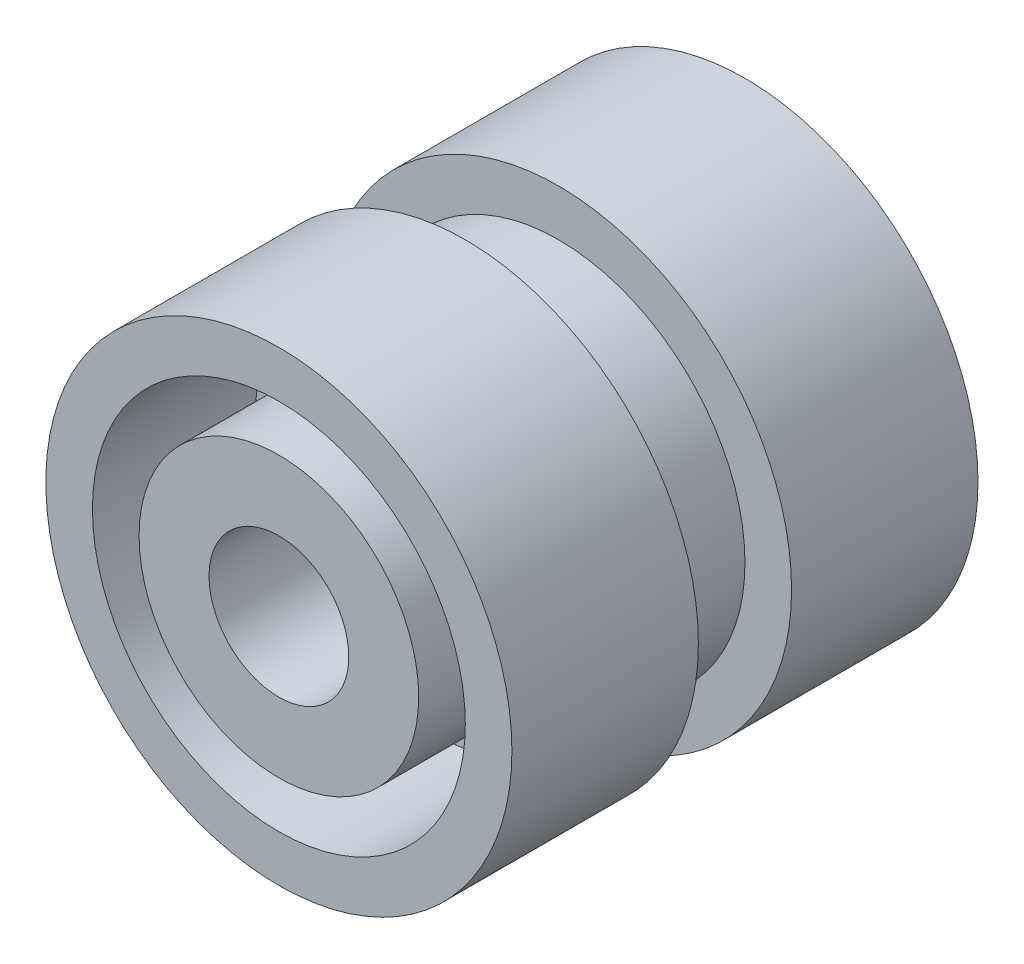
ISO-10303-21;
HEADER;
FILE_DESCRIPTION(('STEP AP214'),'2;1');
FILE_NAME('part.step','',(''),(''),'','','');
FILE_SCHEMA(('AUTOMOTIVE_DESIGN { 1 0 10303 214 1 1 1 1 }'));
ENDSEC;
DATA;
#1=APPLICATION_CONTEXT('core data for automotive mechanical design processes');
#2=APPLICATION_PROTOCOL_DEFINITION('international standard','automotive_design',2000,#1);
#3=PRODUCT_CONTEXT('',#1,'mechanical');
#4=PRODUCT('Part','Part','',(#3));
#5=PRODUCT_RELATED_PRODUCT_CATEGORY('part','',(#4));
#6=PRODUCT_DEFINITION_FORMATION('','',#4);
#7=PRODUCT_DEFINITION_CONTEXT('part definition',#1,'design');
#8=PRODUCT_DEFINITION('design','',#6,#7);
#9=PRODUCT_DEFINITION_SHAPE('','',#8);
#10=(LENGTH_UNIT() NAMED_UNIT(*) SI_UNIT(.MILLI.,.METRE.));
#11=(NAMED_UNIT(*) PLANE_ANGLE_UNIT() SI_UNIT($,.RADIAN.));
#12=(NAMED_UNIT(*) SI_UNIT($,.STERADIAN.) SOLID_ANGLE_UNIT());
#13=UNCERTAINTY_MEASURE_WITH_UNIT(LENGTH_MEASURE(1.E-05),#10,'distance_accuracy_value','');
#14=(GEOMETRIC_REPRESENTATION_CONTEXT(3) GLOBAL_UNCERTAINTY_ASSIGNED_CONTEXT((#13)) GLOBAL_UNIT_ASSIGNED_CONTEXT((#10,
#11,#12)) REPRESENTATION_CONTEXT('',''));
#15=CARTESIAN_POINT('',(0.,0.,0.));
#16=DIRECTION('',(0.,0.,1.));
#17=DIRECTION('',(1.,0.,0.));
#18=AXIS2_PLACEMENT_3D('',#15,#16,#17);
#19=CARTESIAN_POINT('',(0.,4.,-1.5));
#20=DIRECTION('',(0.,0.,1.));
#21=DIRECTION('',(1.,0.,0.));
#22=AXIS2_PLACEMENT_3D('',#19,#20,#21);
#23=PLANE('',#22);
#24=DIRECTION('',(-1.,0.,0.));
#25=VECTOR('',#24,1.);
#26=CARTESIAN_POINT('',(1.93649167310371,-0.5,-1.5));
#27=LINE('',#26,#25);
#28=CARTESIAN_POINT('',(3.96862696659689,-0.500000000000001,-1.5));
#29=VERTEX_POINT('',#28);
#30=CARTESIAN_POINT('',(1.93649167310371,-0.5,-1.5));
#31=VERTEX_POINT('',#30);
#32=EDGE_CURVE('E210',#29,#31,#27,.T.);
#33=ORIENTED_EDGE('',*,*,#32,.F.);
#34=CARTESIAN_POINT('',(0.,0.,-1.5));
#35=DIRECTION('',(0.,0.,1.));
#36=DIRECTION('',(1.,0.,0.));
#37=AXIS2_PLACEMENT_3D('',#34,#35,#36);
#38=CIRCLE('',#37,4.);
#39=CARTESIAN_POINT('',(0.500000000000001,-3.96862696659689,-1.5));
#40=VERTEX_POINT('',#39);
#41=EDGE_CURVE('E286',#40,#29,#38,.T.);
#42=ORIENTED_EDGE('',*,*,#41,.F.);
#43=DIRECTION('',(0.,-1.,0.));
#44=VECTOR('',#43,1.);
#45=CARTESIAN_POINT('',(0.5,-1.93649167310371,-1.5));
#46=LINE('',#45,#44);
#47=CARTESIAN_POINT('',(0.5,-1.93649167310371,-1.5));
#48=VERTEX_POINT('',#47);
#49=EDGE_CURVE('E216',#48,#40,#46,.T.);
#50=ORIENTED_EDGE('',*,*,#49,.F.);
#51=CARTESIAN_POINT('',(0.,0.,-1.5));
#52=DIRECTION('',(0.,0.,-1.));
#53=DIRECTION('',(-1.,0.,0.));
#54=AXIS2_PLACEMENT_3D('',#51,#52,#53);
#55=CIRCLE('',#54,2.);
#56=EDGE_CURVE('E213',#31,#48,#55,.T.);
#57=ORIENTED_EDGE('',*,*,#56,.F.);
#58=EDGE_LOOP('',(#33,#42,#50,#57));
#59=FACE_BOUND('',#58,.T.);
#60=ADVANCED_FACE('F47',(#59),#23,.F.);
#61=DIRECTION('',(0.,1.,0.));
#62=VECTOR('',#61,1.);
#63=CARTESIAN_POINT('',(-0.5,-1.93649167310371,-1.5));
#64=LINE('',#63,#62);
#65=CARTESIAN_POINT('',(-0.5,-3.96862696659689,-1.5));
#66=VERTEX_POINT('',#65);
#67=CARTESIAN_POINT('',(-0.5,-1.93649167310371,-1.5));
#68=VERTEX_POINT('',#67);
#69=EDGE_CURVE('E219',#66,#68,#64,.T.);
#70=ORIENTED_EDGE('',*,*,#69,.F.);
#71=CARTESIAN_POINT('',(-3.96862696659689,-0.500000000000001,-1.5));
#72=VERTEX_POINT('',#71);
#73=EDGE_CURVE('E420',#72,#66,#38,.T.);
#74=ORIENTED_EDGE('',*,*,#73,.F.);
#75=DIRECTION('',(-1.,0.,0.));
#76=VECTOR('',#75,1.);
#77=CARTESIAN_POINT('',(-1.93649167310371,-0.5,-1.5));
#78=LINE('',#77,#76);
#79=CARTESIAN_POINT('',(-1.93649167310371,-0.5,-1.5));
#80=VERTEX_POINT('',#79);
#81=EDGE_CURVE('E225',#80,#72,#78,.T.);
#82=ORIENTED_EDGE('',*,*,#81,.F.);
#83=CARTESIAN_POINT('',(0.,0.,-1.5));
#84=DIRECTION('',(0.,0.,-1.));
#85=DIRECTION('',(-1.,0.,0.));
#86=AXIS2_PLACEMENT_3D('',#83,#84,#85);
#87=CIRCLE('',#86,2.);
#88=EDGE_CURVE('E222',#68,#80,#87,.T.);
#89=ORIENTED_EDGE('',*,*,#88,.F.);
#90=EDGE_LOOP('',(#70,#74,#82,#89));
#91=FACE_BOUND('',#90,.T.);
#92=ADVANCED_FACE('F402',(#91),#23,.F.);
#93=DIRECTION('',(1.,0.,0.));
#94=VECTOR('',#93,1.);
#95=CARTESIAN_POINT('',(-1.93649167310371,0.5,-1.5));
#96=LINE('',#95,#94);
#97=CARTESIAN_POINT('',(-3.96862696659689,0.5,-1.5));
#98=VERTEX_POINT('',#97);
#99=CARTESIAN_POINT('',(-1.93649167310371,0.5,-1.5));
#100=VERTEX_POINT('',#99);
#101=EDGE_CURVE('E228',#98,#100,#96,.T.);
#102=ORIENTED_EDGE('',*,*,#101,.F.);
#103=CARTESIAN_POINT('',(-0.5,3.96862696659689,-1.5));
#104=VERTEX_POINT('',#103);
#105=EDGE_CURVE('E291',#104,#98,#38,.T.);
#106=ORIENTED_EDGE('',*,*,#105,.F.);
#107=DIRECTION('',(0.,1.,0.));
#108=VECTOR('',#107,1.);
#109=CARTESIAN_POINT('',(-0.5,1.93649167310371,-1.5));
#110=LINE('',#109,#108);
#111=CARTESIAN_POINT('',(-0.5,1.93649167310371,-1.5));
#112=VERTEX_POINT('',#111);
#113=EDGE_CURVE('E184',#112,#104,#110,.T.);
#114=ORIENTED_EDGE('',*,*,#113,.F.);
#115=CARTESIAN_POINT('',(0.,0.,-1.5));
#116=DIRECTION('',(0.,0.,-1.));
#117=DIRECTION('',(-1.,0.,0.));
#118=AXIS2_PLACEMENT_3D('',#115,#116,#117);
#119=CIRCLE('',#118,2.);
#120=EDGE_CURVE('E231',#100,#112,#119,.T.);
#121=ORIENTED_EDGE('',*,*,#120,.F.);
#122=EDGE_LOOP('',(#102,#106,#114,#121));
#123=FACE_BOUND('',#122,.T.);
#124=ADVANCED_FACE('F398',(#123),#23,.F.);
#125=DIRECTION('',(1.,0.,0.));
#126=VECTOR('',#125,1.);
#127=CARTESIAN_POINT('',(1.93649167310371,0.5,-1.5));
#128=LINE('',#127,#126);
#129=CARTESIAN_POINT('',(1.93649167310371,0.5,-1.5));
#130=VERTEX_POINT('',#129);
#131=CARTESIAN_POINT('',(3.96862696659689,0.499999999999999,-1.5));
#132=VERTEX_POINT('',#131);
#133=EDGE_CURVE('E207',#130,#132,#128,.T.);
#134=ORIENTED_EDGE('',*,*,#133,.F.);
#135=CARTESIAN_POINT('',(0.,0.,-1.5));
#136=DIRECTION('',(0.,0.,-1.));
#137=DIRECTION('',(-1.,0.,0.));
#138=AXIS2_PLACEMENT_3D('',#135,#136,#137);
#139=CIRCLE('',#138,2.);
#140=CARTESIAN_POINT('',(0.5,1.93649167310371,-1.5));
#141=VERTEX_POINT('',#140);
#142=EDGE_CURVE('E203',#141,#130,#139,.T.);
#143=ORIENTED_EDGE('',*,*,#142,.F.);
#144=DIRECTION('',(0.,-1.,0.));
#145=VECTOR('',#144,1.);
#146=CARTESIAN_POINT('',(0.5,1.93649167310371,-1.5));
#147=LINE('',#146,#145);
#148=CARTESIAN_POINT('',(0.5,3.96862696659689,-1.5));
#149=VERTEX_POINT('',#148);
#150=EDGE_CURVE('E126',#149,#141,#147,.T.);
#151=ORIENTED_EDGE('',*,*,#150,.F.);
#152=EDGE_CURVE('E287',#132,#149,#38,.T.);
#153=ORIENTED_EDGE('',*,*,#152,.F.);
#154=EDGE_LOOP('',(#134,#143,#151,#153));
#155=FACE_BOUND('',#154,.T.);
#156=ADVANCED_FACE('F390',(#155),#23,.F.);
#157=CARTESIAN_POINT('',(0.,0.,8.24782020276154));
#158=DIRECTION('',(0.,0.,1.));
#159=DIRECTION('',(1.,0.,0.));
#160=AXIS2_PLACEMENT_3D('',#157,#158,#159);
#161=CYLINDRICAL_SURFACE('',#160,4.);
#162=CARTESIAN_POINT('',(0.,0.,-5.));
#163=DIRECTION('',(0.,0.,1.));
#164=DIRECTION('',(1.,0.,0.));
#165=AXIS2_PLACEMENT_3D('',#162,#163,#164);
#166=CIRCLE('',#165,4.);
#167=CARTESIAN_POINT('',(4.,0.,-5.));
#168=VERTEX_POINT('',#167);
#169=EDGE_CURVE('E290',#168,#168,#166,.T.);
#170=ORIENTED_EDGE('',*,*,#169,.F.);
#171=EDGE_LOOP('',(#170));
#172=FACE_BOUND('',#171,.T.);
#173=DIRECTION('',(0.,0.,1.));
#174=VECTOR('',#173,1.);
#175=CARTESIAN_POINT('',(0.500000000000001,-3.96862696659689,-3.5));
#176=LINE('',#175,#174);
#177=CARTESIAN_POINT('',(0.500000000000001,-3.96862696659689,-3.5));
#178=VERTEX_POINT('',#177);
#179=EDGE_CURVE('E265',#178,#40,#176,.T.);
#180=ORIENTED_EDGE('',*,*,#179,.T.);
#181=ORIENTED_EDGE('',*,*,#41,.T.);
#182=DIRECTION('',(0.,0.,1.));
#183=VECTOR('',#182,1.);
#184=CARTESIAN_POINT('',(3.96862696659689,-0.500000000000001,-3.5));
#185=LINE('',#184,#183);
#186=CARTESIAN_POINT('',(3.96862696659689,-0.500000000000001,-3.5));
#187=VERTEX_POINT('',#186);
#188=EDGE_CURVE('E276',#187,#29,#185,.T.);
#189=ORIENTED_EDGE('',*,*,#188,.F.);
#190=CARTESIAN_POINT('',(0.,0.,-3.5));
#191=DIRECTION('',(0.,0.,-1.));
#192=DIRECTION('',(-1.,0.,0.));
#193=AXIS2_PLACEMENT_3D('',#190,#191,#192);
#194=CIRCLE('',#193,4.);
#195=CARTESIAN_POINT('',(3.96862696659689,0.499999999999999,-3.5));
#196=VERTEX_POINT('',#195);
#197=EDGE_CURVE('E466',#196,#187,#194,.T.);
#198=ORIENTED_EDGE('',*,*,#197,.F.);
#199=DIRECTION('',(0.,0.,1.));
#200=VECTOR('',#199,1.);
#201=CARTESIAN_POINT('',(3.96862696659689,0.499999999999999,-3.5));
#202=LINE('',#201,#200);
#203=EDGE_CURVE('E279',#196,#132,#202,.T.);
#204=ORIENTED_EDGE('',*,*,#203,.T.);
#205=ORIENTED_EDGE('',*,*,#152,.T.);
#206=DIRECTION('',(0.,0.,1.));
#207=VECTOR('',#206,1.);
#208=CARTESIAN_POINT('',(0.5,3.96862696659689,-3.5));
#209=LINE('',#208,#207);
#210=CARTESIAN_POINT('',(0.5,3.96862696659689,-3.5));
#211=VERTEX_POINT('',#210);
#212=EDGE_CURVE('E190',#211,#149,#209,.T.);
#213=ORIENTED_EDGE('',*,*,#212,.F.);
#214=CARTESIAN_POINT('',(0.,0.,-3.5));
#215=DIRECTION('',(0.,0.,-1.));
#216=DIRECTION('',(-1.,0.,0.));
#217=AXIS2_PLACEMENT_3D('',#214,#215,#216);
#218=CIRCLE('',#217,4.);
#219=CARTESIAN_POINT('',(-0.5,3.96862696659689,-3.5));
#220=VERTEX_POINT('',#219);
#221=EDGE_CURVE('E172',#220,#211,#218,.T.);
#222=ORIENTED_EDGE('',*,*,#221,.F.);
#223=DIRECTION('',(0.,0.,1.));
#224=VECTOR('',#223,1.);
#225=CARTESIAN_POINT('',(-0.5,3.96862696659689,-3.5));
#226=LINE('',#225,#224);
#227=EDGE_CURVE('E181',#220,#104,#226,.T.);
#228=ORIENTED_EDGE('',*,*,#227,.T.);
#229=ORIENTED_EDGE('',*,*,#105,.T.);
#230=DIRECTION('',(0.,0.,1.));
#231=VECTOR('',#230,1.);
#232=CARTESIAN_POINT('',(-3.96862696659689,0.5,-3.5));
#233=LINE('',#232,#231);
#234=CARTESIAN_POINT('',(-3.96862696659689,0.5,-3.5));
#235=VERTEX_POINT('',#234);
#236=EDGE_CURVE('E249',#235,#98,#233,.T.);
#237=ORIENTED_EDGE('',*,*,#236,.F.);
#238=CARTESIAN_POINT('',(0.,0.,-3.5));
#239=DIRECTION('',(0.,0.,-1.));
#240=DIRECTION('',(-1.,0.,0.));
#241=AXIS2_PLACEMENT_3D('',#238,#239,#240);
#242=CIRCLE('',#241,4.);
#243=CARTESIAN_POINT('',(-3.96862696659689,-0.5,-3.5));
#244=VERTEX_POINT('',#243);
#245=EDGE_CURVE('E440',#244,#235,#242,.T.);
#246=ORIENTED_EDGE('',*,*,#245,.F.);
#247=DIRECTION('',(0.,0.,1.));
#248=VECTOR('',#247,1.);
#249=CARTESIAN_POINT('',(-3.96862696659689,-0.500000000000001,-3.5));
#250=LINE('',#249,#248);
#251=EDGE_CURVE('E63',#244,#72,#250,.T.);
#252=ORIENTED_EDGE('',*,*,#251,.T.);
#253=ORIENTED_EDGE('',*,*,#73,.T.);
#254=DIRECTION('',(0.,0.,1.));
#255=VECTOR('',#254,1.);
#256=CARTESIAN_POINT('',(-0.5,-3.96862696659689,-3.5));
#257=LINE('',#256,#255);
#258=CARTESIAN_POINT('',(-0.5,-3.96862696659689,-3.5));
#259=VERTEX_POINT('',#258);
#260=EDGE_CURVE('E262',#259,#66,#257,.T.);
#261=ORIENTED_EDGE('',*,*,#260,.F.);
#262=CARTESIAN_POINT('',(0.,0.,-3.5));
#263=DIRECTION('',(0.,0.,-1.));
#264=DIRECTION('',(-1.,0.,0.));
#265=AXIS2_PLACEMENT_3D('',#262,#263,#264);
#266=CIRCLE('',#265,4.);
#267=EDGE_CURVE('E454',#178,#259,#266,.T.);
#268=ORIENTED_EDGE('',*,*,#267,.F.);
#269=EDGE_LOOP('',(#180,#181,#189,#198,#204,#205,#213,#222,#228,#229,#237,#246,#252,#253,#261,#268));
#270=FACE_BOUND('',#269,.T.);
#271=ADVANCED_FACE('F194',(#172,#270),#161,.F.);
#272=CARTESIAN_POINT('',(0.,0.,5.));
#273=DIRECTION('',(0.,0.,-1.));
#274=DIRECTION('',(-1.,0.,0.));
#275=AXIS2_PLACEMENT_3D('',#272,#273,#274);
#276=PLANE('',#275);
#277=CARTESIAN_POINT('',(0.,0.,5.));
#278=DIRECTION('',(0.,0.,-1.));
#279=DIRECTION('',(-1.,0.,0.));
#280=AXIS2_PLACEMENT_3D('',#277,#278,#279);
#281=CIRCLE('',#280,1.5);
#282=CARTESIAN_POINT('',(-1.5,0.,5.));
#283=VERTEX_POINT('',#282);
#284=EDGE_CURVE('E50',#283,#283,#281,.F.);
#285=ORIENTED_EDGE('',*,*,#284,.F.);
#286=EDGE_LOOP('',(#285));
#287=FACE_BOUND('',#286,.T.);
#288=CARTESIAN_POINT('',(0.,0.,5.));
#289=DIRECTION('',(0.,0.,1.));
#290=DIRECTION('',(1.,0.,0.));
#291=AXIS2_PLACEMENT_3D('',#288,#289,#290);
#292=CIRCLE('',#291,3.);
#293=CARTESIAN_POINT('',(3.,0.,5.));
#294=VERTEX_POINT('',#293);
#295=EDGE_CURVE('E11',#294,#294,#292,.T.);
#296=ORIENTED_EDGE('',*,*,#295,.T.);
#297=EDGE_LOOP('',(#296));
#298=FACE_BOUND('',#297,.T.);
#299=ADVANCED_FACE('F389',(#287,#298),#276,.F.);
#300=CARTESIAN_POINT('',(0.,0.,8.24782020276154));
#301=DIRECTION('',(0.,0.,1.));
#302=DIRECTION('',(1.,0.,0.));
#303=AXIS2_PLACEMENT_3D('',#300,#301,#302);
#304=CYLINDRICAL_SURFACE('',#303,3.);
#305=ORIENTED_EDGE('',*,*,#295,.F.);
#306=EDGE_LOOP('',(#305));
#307=FACE_BOUND('',#306,.T.);
#308=CARTESIAN_POINT('',(0.,0.,1.5));
#309=DIRECTION('',(0.,0.,1.));
#310=DIRECTION('',(1.,0.,0.));
#311=AXIS2_PLACEMENT_3D('',#308,#309,#310);
#312=CIRCLE('',#311,3.);
#313=CARTESIAN_POINT('',(3.,0.,1.5));
#314=VERTEX_POINT('',#313);
#315=EDGE_CURVE('E56',#314,#314,#312,.T.);
#316=ORIENTED_EDGE('',*,*,#315,.T.);
#317=EDGE_LOOP('',(#316));
#318=FACE_BOUND('',#317,.T.);
#319=ADVANCED_FACE('F331',(#307,#318),#304,.T.);
#320=CARTESIAN_POINT('',(0.,4.,1.5));
#321=DIRECTION('',(0.,0.,-1.));
#322=DIRECTION('',(-1.,0.,0.));
#323=AXIS2_PLACEMENT_3D('',#320,#321,#322);
#324=PLANE('',#323);
#325=ORIENTED_EDGE('',*,*,#315,.F.);
#326=EDGE_LOOP('',(#325));
#327=FACE_BOUND('',#326,.T.);
#328=CARTESIAN_POINT('',(0.,0.,1.5));
#329=DIRECTION('',(0.,0.,1.));
#330=DIRECTION('',(1.,0.,0.));
#331=AXIS2_PLACEMENT_3D('',#328,#329,#330);
#332=CIRCLE('',#331,4.);
#333=CARTESIAN_POINT('',(4.,0.,1.5));
#334=VERTEX_POINT('',#333);
#335=EDGE_CURVE('E323',#334,#334,#332,.T.);
#336=ORIENTED_EDGE('',*,*,#335,.T.);
#337=EDGE_LOOP('',(#336));
#338=FACE_BOUND('',#337,.T.);
#339=ADVANCED_FACE('F333',(#327,#338),#324,.F.);
#340=CARTESIAN_POINT('',(0.,0.,8.24782020276154));
#341=DIRECTION('',(0.,0.,1.));
#342=DIRECTION('',(1.,0.,0.));
#343=AXIS2_PLACEMENT_3D('',#340,#341,#342);
#344=CYLINDRICAL_SURFACE('',#343,4.);
#345=ORIENTED_EDGE('',*,*,#335,.F.);
#346=EDGE_LOOP('',(#345));
#347=FACE_BOUND('',#346,.T.);
#348=CARTESIAN_POINT('',(0.,0.,5.));
#349=DIRECTION('',(0.,0.,1.));
#350=DIRECTION('',(1.,0.,0.));
#351=AXIS2_PLACEMENT_3D('',#348,#349,#350);
#352=CIRCLE('',#351,4.);
#353=CARTESIAN_POINT('',(4.,0.,5.));
#354=VERTEX_POINT('',#353);
#355=EDGE_CURVE('E319',#354,#354,#352,.T.);
#356=ORIENTED_EDGE('',*,*,#355,.T.);
#357=EDGE_LOOP('',(#356));
#358=FACE_BOUND('',#357,.T.);
#359=ADVANCED_FACE('F336',(#347,#358),#344,.F.);
#360=CARTESIAN_POINT('',(0.,4.,5.));
#361=DIRECTION('',(0.,0.,-1.));
#362=DIRECTION('',(-1.,0.,0.));
#363=AXIS2_PLACEMENT_3D('',#360,#361,#362);
#364=PLANE('',#363);
#365=ORIENTED_EDGE('',*,*,#355,.F.);
#366=EDGE_LOOP('',(#365));
#367=FACE_BOUND('',#366,.T.);
#368=CARTESIAN_POINT('',(0.,0.,5.));
#369=DIRECTION('',(0.,0.,1.));
#370=DIRECTION('',(1.,0.,0.));
#371=AXIS2_PLACEMENT_3D('',#368,#369,#370);
#372=CIRCLE('',#371,5.);
#373=CARTESIAN_POINT('',(5.,0.,5.));
#374=VERTEX_POINT('',#373);
#375=EDGE_CURVE('E315',#374,#374,#372,.T.);
#376=ORIENTED_EDGE('',*,*,#375,.T.);
#377=EDGE_LOOP('',(#376));
#378=FACE_BOUND('',#377,.T.);
#379=ADVANCED_FACE('F342',(#367,#378),#364,.F.);
#380=CARTESIAN_POINT('',(0.,0.,8.24782020276154));
#381=DIRECTION('',(0.,0.,1.));
#382=DIRECTION('',(1.,0.,0.));
#383=AXIS2_PLACEMENT_3D('',#380,#381,#382);
#384=CYLINDRICAL_SURFACE('',#383,5.);
#385=ORIENTED_EDGE('',*,*,#375,.F.);
#386=EDGE_LOOP('',(#385));
#387=FACE_BOUND('',#386,.T.);
#388=CARTESIAN_POINT('',(0.,0.,1.));
#389=DIRECTION('',(0.,0.,1.));
#390=DIRECTION('',(1.,0.,0.));
#391=AXIS2_PLACEMENT_3D('',#388,#389,#390);
#392=CIRCLE('',#391,5.);
#393=CARTESIAN_POINT('',(5.,0.,1.));
#394=VERTEX_POINT('',#393);
#395=EDGE_CURVE('E311',#394,#394,#392,.T.);
#396=ORIENTED_EDGE('',*,*,#395,.T.);
#397=EDGE_LOOP('',(#396));
#398=FACE_BOUND('',#397,.T.);
#399=ADVANCED_FACE('F348',(#387,#398),#384,.T.);
#400=CARTESIAN_POINT('',(0.,5.,1.));
#401=DIRECTION('',(0.,0.,1.));
#402=DIRECTION('',(1.,0.,0.));
#403=AXIS2_PLACEMENT_3D('',#400,#401,#402);
#404=PLANE('',#403);
#405=ORIENTED_EDGE('',*,*,#395,.F.);
#406=EDGE_LOOP('',(#405));
#407=FACE_BOUND('',#406,.T.);
#408=CARTESIAN_POINT('',(0.,0.,1.));
#409=DIRECTION('',(0.,0.,1.));
#410=DIRECTION('',(1.,0.,0.));
#411=AXIS2_PLACEMENT_3D('',#408,#409,#410);
#412=CIRCLE('',#411,4.);
#413=CARTESIAN_POINT('',(4.,0.,1.));
#414=VERTEX_POINT('',#413);
#415=EDGE_CURVE('E307',#414,#414,#412,.T.);
#416=ORIENTED_EDGE('',*,*,#415,.T.);
#417=EDGE_LOOP('',(#416));
#418=FACE_BOUND('',#417,.T.);
#419=ADVANCED_FACE('F354',(#407,#418),#404,.F.);
#420=CARTESIAN_POINT('',(0.,0.,8.24782020276154));
#421=DIRECTION('',(0.,0.,1.));
#422=DIRECTION('',(1.,0.,0.));
#423=AXIS2_PLACEMENT_3D('',#420,#421,#422);
#424=CYLINDRICAL_SURFACE('',#423,4.);
#425=ORIENTED_EDGE('',*,*,#415,.F.);
#426=EDGE_LOOP('',(#425));
#427=FACE_BOUND('',#426,.T.);
#428=CARTESIAN_POINT('',(0.,0.,-0.999999999999999));
#429=DIRECTION('',(0.,0.,1.));
#430=DIRECTION('',(1.,0.,0.));
#431=AXIS2_PLACEMENT_3D('',#428,#429,#430);
#432=CIRCLE('',#431,4.);
#433=CARTESIAN_POINT('',(4.,0.,-0.999999999999999));
#434=VERTEX_POINT('',#433);
#435=EDGE_CURVE('E303',#434,#434,#432,.T.);
#436=ORIENTED_EDGE('',*,*,#435,.T.);
#437=EDGE_LOOP('',(#436));
#438=FACE_BOUND('',#437,.T.);
#439=ADVANCED_FACE('F360',(#427,#438),#424,.T.);
#440=CARTESIAN_POINT('',(0.,5.,-1.));
#441=DIRECTION('',(0.,0.,-1.));
#442=DIRECTION('',(-1.,0.,0.));
#443=AXIS2_PLACEMENT_3D('',#440,#441,#442);
#444=PLANE('',#443);
#445=ORIENTED_EDGE('',*,*,#435,.F.);
#446=EDGE_LOOP('',(#445));
#447=FACE_BOUND('',#446,.T.);
#448=CARTESIAN_POINT('',(0.,0.,-0.999999999999999));
#449=DIRECTION('',(0.,0.,1.));
#450=DIRECTION('',(1.,0.,0.));
#451=AXIS2_PLACEMENT_3D('',#448,#449,#450);
#452=CIRCLE('',#451,5.);
#453=CARTESIAN_POINT('',(5.,0.,-0.999999999999999));
#454=VERTEX_POINT('',#453);
#455=EDGE_CURVE('E299',#454,#454,#452,.T.);
#456=ORIENTED_EDGE('',*,*,#455,.T.);
#457=EDGE_LOOP('',(#456));
#458=FACE_BOUND('',#457,.T.);
#459=ADVANCED_FACE('F366',(#447,#458),#444,.F.);
#460=CARTESIAN_POINT('',(0.,0.,8.24782020276154));
#461=DIRECTION('',(0.,0.,1.));
#462=DIRECTION('',(1.,0.,0.));
#463=AXIS2_PLACEMENT_3D('',#460,#461,#462);
#464=CYLINDRICAL_SURFACE('',#463,5.);
#465=ORIENTED_EDGE('',*,*,#455,.F.);
#466=EDGE_LOOP('',(#465));
#467=FACE_BOUND('',#466,.T.);
#468=CARTESIAN_POINT('',(0.,0.,-5.));
#469=DIRECTION('',(0.,0.,1.));
#470=DIRECTION('',(1.,0.,0.));
#471=AXIS2_PLACEMENT_3D('',#468,#469,#470);
#472=CIRCLE('',#471,5.);
#473=CARTESIAN_POINT('',(5.,0.,-5.));
#474=VERTEX_POINT('',#473);
#475=EDGE_CURVE('E295',#474,#474,#472,.T.);
#476=ORIENTED_EDGE('',*,*,#475,.T.);
#477=EDGE_LOOP('',(#476));
#478=FACE_BOUND('',#477,.T.);
#479=ADVANCED_FACE('F372',(#467,#478),#464,.T.);
#480=CARTESIAN_POINT('',(0.,4.,-5.));
#481=DIRECTION('',(0.,0.,1.));
#482=DIRECTION('',(1.,0.,0.));
#483=AXIS2_PLACEMENT_3D('',#480,#481,#482);
#484=PLANE('',#483);
#485=ORIENTED_EDGE('',*,*,#475,.F.);
#486=EDGE_LOOP('',(#485));
#487=FACE_BOUND('',#486,.T.);
#488=ORIENTED_EDGE('',*,*,#169,.T.);
#489=EDGE_LOOP('',(#488));
#490=FACE_BOUND('',#489,.T.);
#491=ADVANCED_FACE('F378',(#487,#490),#484,.F.);
#492=CARTESIAN_POINT('',(0.,0.,-3.5));
#493=DIRECTION('',(0.,0.,1.));
#494=DIRECTION('',(1.,0.,0.));
#495=AXIS2_PLACEMENT_3D('',#492,#493,#494);
#496=CYLINDRICAL_SURFACE('',#495,2.);
#497=ORIENTED_EDGE('',*,*,#142,.T.);
#498=DIRECTION('',(0.,0.,1.));
#499=VECTOR('',#498,1.);
#500=CARTESIAN_POINT('',(1.93649167310371,0.5,-3.5));
#501=LINE('',#500,#499);
#502=CARTESIAN_POINT('',(1.93649167310371,0.5,-3.5));
#503=VERTEX_POINT('',#502);
#504=EDGE_CURVE('E283',#503,#130,#501,.T.);
#505=ORIENTED_EDGE('',*,*,#504,.F.);
#506=CARTESIAN_POINT('',(0.,0.,-3.5));
#507=DIRECTION('',(0.,0.,-1.));
#508=DIRECTION('',(-1.,0.,0.));
#509=AXIS2_PLACEMENT_3D('',#506,#507,#508);
#510=CIRCLE('',#509,2.);
#511=CARTESIAN_POINT('',(0.5,1.93649167310371,-3.5));
#512=VERTEX_POINT('',#511);
#513=EDGE_CURVE('E238',#512,#503,#510,.T.);
#514=ORIENTED_EDGE('',*,*,#513,.F.);
#515=DIRECTION('',(0.,0.,1.));
#516=VECTOR('',#515,1.);
#517=CARTESIAN_POINT('',(0.5,1.93649167310371,-3.5));
#518=LINE('',#517,#516);
#519=EDGE_CURVE('E199',#512,#141,#518,.T.);
#520=ORIENTED_EDGE('',*,*,#519,.T.);
#521=EDGE_LOOP('',(#497,#505,#514,#520));
#522=FACE_BOUND('',#521,.T.);
#523=ADVANCED_FACE('F384',(#522),#496,.T.);
#524=CARTESIAN_POINT('',(1.93649167310371,0.5,-3.5));
#525=DIRECTION('',(0.,-1.,0.));
#526=DIRECTION('',(1.,0.,0.));
#527=AXIS2_PLACEMENT_3D('',#524,#525,#526);
#528=PLANE('',#527);
#529=ORIENTED_EDGE('',*,*,#133,.T.);
#530=ORIENTED_EDGE('',*,*,#203,.F.);
#531=DIRECTION('',(1.,0.,0.));
#532=VECTOR('',#531,1.);
#533=CARTESIAN_POINT('',(1.93649167310371,0.5,-3.5));
#534=LINE('',#533,#532);
#535=EDGE_CURVE('E134',#503,#196,#534,.T.);
#536=ORIENTED_EDGE('',*,*,#535,.F.);
#537=ORIENTED_EDGE('',*,*,#504,.T.);
#538=EDGE_LOOP('',(#529,#530,#536,#537));
#539=FACE_BOUND('',#538,.T.);
#540=ADVANCED_FACE('F569',(#539),#528,.F.);
#541=CARTESIAN_POINT('',(1.93649167310371,-0.5,-3.5));
#542=DIRECTION('',(0.,1.,0.));
#543=DIRECTION('',(-1.,0.,0.));
#544=AXIS2_PLACEMENT_3D('',#541,#542,#543);
#545=PLANE('',#544);
#546=ORIENTED_EDGE('',*,*,#32,.T.);
#547=DIRECTION('',(0.,0.,1.));
#548=VECTOR('',#547,1.);
#549=CARTESIAN_POINT('',(1.93649167310371,-0.5,-3.5));
#550=LINE('',#549,#548);
#551=CARTESIAN_POINT('',(1.93649167310371,-0.5,-3.5));
#552=VERTEX_POINT('',#551);
#553=EDGE_CURVE('E272',#552,#31,#550,.T.);
#554=ORIENTED_EDGE('',*,*,#553,.F.);
#555=DIRECTION('',(-1.,0.,0.));
#556=VECTOR('',#555,1.);
#557=CARTESIAN_POINT('',(1.93649167310371,-0.5,-3.5));
#558=LINE('',#557,#556);
#559=EDGE_CURVE('E463',#187,#552,#558,.T.);
#560=ORIENTED_EDGE('',*,*,#559,.F.);
#561=ORIENTED_EDGE('',*,*,#188,.T.);
#562=EDGE_LOOP('',(#546,#554,#560,#561));
#563=FACE_BOUND('',#562,.T.);
#564=ADVANCED_FACE('F578',(#563),#545,.F.);
#565=CARTESIAN_POINT('',(0.,0.,-3.5));
#566=DIRECTION('',(0.,0.,1.));
#567=DIRECTION('',(1.,0.,0.));
#568=AXIS2_PLACEMENT_3D('',#565,#566,#567);
#569=CYLINDRICAL_SURFACE('',#568,2.);
#570=ORIENTED_EDGE('',*,*,#56,.T.);
#571=DIRECTION('',(0.,0.,1.));
#572=VECTOR('',#571,1.);
#573=CARTESIAN_POINT('',(0.5,-1.93649167310371,-3.5));
#574=LINE('',#573,#572);
#575=CARTESIAN_POINT('',(0.5,-1.93649167310371,-3.5));
#576=VERTEX_POINT('',#575);
#577=EDGE_CURVE('E268',#576,#48,#574,.T.);
#578=ORIENTED_EDGE('',*,*,#577,.F.);
#579=CARTESIAN_POINT('',(0.,0.,-3.5));
#580=DIRECTION('',(0.,0.,-1.));
#581=DIRECTION('',(-1.,0.,0.));
#582=AXIS2_PLACEMENT_3D('',#579,#580,#581);
#583=CIRCLE('',#582,2.);
#584=EDGE_CURVE('E460',#552,#576,#583,.T.);
#585=ORIENTED_EDGE('',*,*,#584,.F.);
#586=ORIENTED_EDGE('',*,*,#553,.T.);
#587=EDGE_LOOP('',(#570,#578,#585,#586));
#588=FACE_BOUND('',#587,.T.);
#589=ADVANCED_FACE('F587',(#588),#569,.T.);
#590=CARTESIAN_POINT('',(0.5,-1.93649167310371,-3.5));
#591=DIRECTION('',(-1.,0.,0.));
#592=DIRECTION('',(0.,-1.,0.));
#593=AXIS2_PLACEMENT_3D('',#590,#591,#592);
#594=PLANE('',#593);
#595=ORIENTED_EDGE('',*,*,#49,.T.);
#596=ORIENTED_EDGE('',*,*,#179,.F.);
#597=DIRECTION('',(0.,-1.,0.));
#598=VECTOR('',#597,1.);
#599=CARTESIAN_POINT('',(0.5,-1.93649167310371,-3.5));
#600=LINE('',#599,#598);
#601=EDGE_CURVE('E457',#576,#178,#600,.T.);
#602=ORIENTED_EDGE('',*,*,#601,.F.);
#603=ORIENTED_EDGE('',*,*,#577,.T.);
#604=EDGE_LOOP('',(#595,#596,#602,#603));
#605=FACE_BOUND('',#604,.T.);
#606=ADVANCED_FACE('F596',(#605),#594,.F.);
#607=CARTESIAN_POINT('',(-0.5,-1.93649167310371,-3.5));
#608=DIRECTION('',(1.,0.,0.));
#609=DIRECTION('',(0.,1.,0.));
#610=AXIS2_PLACEMENT_3D('',#607,#608,#609);
#611=PLANE('',#610);
#612=ORIENTED_EDGE('',*,*,#69,.T.);
#613=DIRECTION('',(0.,0.,1.));
#614=VECTOR('',#613,1.);
#615=CARTESIAN_POINT('',(-0.5,-1.93649167310371,-3.5));
#616=LINE('',#615,#614);
#617=CARTESIAN_POINT('',(-0.5,-1.93649167310371,-3.5));
#618=VERTEX_POINT('',#617);
#619=EDGE_CURVE('E258',#618,#68,#616,.T.);
#620=ORIENTED_EDGE('',*,*,#619,.F.);
#621=DIRECTION('',(0.,1.,0.));
#622=VECTOR('',#621,1.);
#623=CARTESIAN_POINT('',(-0.5,-1.93649167310371,-3.5));
#624=LINE('',#623,#622);
#625=EDGE_CURVE('E451',#259,#618,#624,.T.);
#626=ORIENTED_EDGE('',*,*,#625,.F.);
#627=ORIENTED_EDGE('',*,*,#260,.T.);
#628=EDGE_LOOP('',(#612,#620,#626,#627));
#629=FACE_BOUND('',#628,.T.);
#630=ADVANCED_FACE('F606',(#629),#611,.F.);
#631=CARTESIAN_POINT('',(0.,0.,-3.5));
#632=DIRECTION('',(0.,0.,1.));
#633=DIRECTION('',(1.,0.,0.));
#634=AXIS2_PLACEMENT_3D('',#631,#632,#633);
#635=CYLINDRICAL_SURFACE('',#634,2.);
#636=ORIENTED_EDGE('',*,*,#88,.T.);
#637=DIRECTION('',(0.,0.,1.));
#638=VECTOR('',#637,1.);
#639=CARTESIAN_POINT('',(-1.93649167310371,-0.5,-3.5));
#640=LINE('',#639,#638);
#641=CARTESIAN_POINT('',(-1.93649167310371,-0.5,-3.5));
#642=VERTEX_POINT('',#641);
#643=EDGE_CURVE('E254',#642,#80,#640,.T.);
#644=ORIENTED_EDGE('',*,*,#643,.F.);
#645=CARTESIAN_POINT('',(0.,0.,-3.5));
#646=DIRECTION('',(0.,0.,-1.));
#647=DIRECTION('',(-1.,0.,0.));
#648=AXIS2_PLACEMENT_3D('',#645,#646,#647);
#649=CIRCLE('',#648,2.);
#650=EDGE_CURVE('E448',#618,#642,#649,.T.);
#651=ORIENTED_EDGE('',*,*,#650,.F.);
#652=ORIENTED_EDGE('',*,*,#619,.T.);
#653=EDGE_LOOP('',(#636,#644,#651,#652));
#654=FACE_BOUND('',#653,.T.);
#655=ADVANCED_FACE('F616',(#654),#635,.T.);
#656=CARTESIAN_POINT('',(-1.93649167310371,-0.5,-3.5));
#657=DIRECTION('',(0.,1.,0.));
#658=DIRECTION('',(-1.,0.,0.));
#659=AXIS2_PLACEMENT_3D('',#656,#657,#658);
#660=PLANE('',#659);
#661=ORIENTED_EDGE('',*,*,#81,.T.);
#662=ORIENTED_EDGE('',*,*,#251,.F.);
#663=DIRECTION('',(-1.,0.,0.));
#664=VECTOR('',#663,1.);
#665=CARTESIAN_POINT('',(-1.93649167310371,-0.5,-3.5));
#666=LINE('',#665,#664);
#667=EDGE_CURVE('E445',#642,#244,#666,.T.);
#668=ORIENTED_EDGE('',*,*,#667,.F.);
#669=ORIENTED_EDGE('',*,*,#643,.T.);
#670=EDGE_LOOP('',(#661,#662,#668,#669));
#671=FACE_BOUND('',#670,.T.);
#672=ADVANCED_FACE('F626',(#671),#660,.F.);
#673=CARTESIAN_POINT('',(-1.93649167310371,0.5,-3.5));
#674=DIRECTION('',(0.,-1.,0.));
#675=DIRECTION('',(1.,0.,0.));
#676=AXIS2_PLACEMENT_3D('',#673,#674,#675);
#677=PLANE('',#676);
#678=ORIENTED_EDGE('',*,*,#101,.T.);
#679=DIRECTION('',(0.,0.,1.));
#680=VECTOR('',#679,1.);
#681=CARTESIAN_POINT('',(-1.93649167310371,0.5,-3.5));
#682=LINE('',#681,#680);
#683=CARTESIAN_POINT('',(-1.93649167310371,0.5,-3.5));
#684=VERTEX_POINT('',#683);
#685=EDGE_CURVE('E245',#684,#100,#682,.T.);
#686=ORIENTED_EDGE('',*,*,#685,.F.);
#687=DIRECTION('',(1.,0.,0.));
#688=VECTOR('',#687,1.);
#689=CARTESIAN_POINT('',(-1.93649167310371,0.5,-3.5));
#690=LINE('',#689,#688);
#691=EDGE_CURVE('E438',#235,#684,#690,.T.);
#692=ORIENTED_EDGE('',*,*,#691,.F.);
#693=ORIENTED_EDGE('',*,*,#236,.T.);
#694=EDGE_LOOP('',(#678,#686,#692,#693));
#695=FACE_BOUND('',#694,.T.);
#696=ADVANCED_FACE('F433',(#695),#677,.F.);
#697=CARTESIAN_POINT('',(0.,0.,-3.5));
#698=DIRECTION('',(0.,0.,1.));
#699=DIRECTION('',(1.,0.,0.));
#700=AXIS2_PLACEMENT_3D('',#697,#698,#699);
#701=CYLINDRICAL_SURFACE('',#700,2.);
#702=ORIENTED_EDGE('',*,*,#120,.T.);
#703=DIRECTION('',(0.,0.,1.));
#704=VECTOR('',#703,1.);
#705=CARTESIAN_POINT('',(-0.5,1.93649167310371,-3.5));
#706=LINE('',#705,#704);
#707=CARTESIAN_POINT('',(-0.5,1.93649167310371,-3.5));
#708=VERTEX_POINT('',#707);
#709=EDGE_CURVE('E189',#708,#112,#706,.T.);
#710=ORIENTED_EDGE('',*,*,#709,.F.);
#711=CARTESIAN_POINT('',(0.,0.,-3.5));
#712=DIRECTION('',(0.,0.,-1.));
#713=DIRECTION('',(-1.,0.,0.));
#714=AXIS2_PLACEMENT_3D('',#711,#712,#713);
#715=CIRCLE('',#714,2.);
#716=EDGE_CURVE('E174',#684,#708,#715,.T.);
#717=ORIENTED_EDGE('',*,*,#716,.F.);
#718=ORIENTED_EDGE('',*,*,#685,.T.);
#719=EDGE_LOOP('',(#702,#710,#717,#718));
#720=FACE_BOUND('',#719,.T.);
#721=ADVANCED_FACE('F436',(#720),#701,.T.);
#722=CARTESIAN_POINT('',(-0.5,1.93649167310371,-3.5));
#723=DIRECTION('',(1.,0.,0.));
#724=DIRECTION('',(0.,0.,-1.));
#725=AXIS2_PLACEMENT_3D('',#722,#723,#724);
#726=PLANE('',#725);
#727=ORIENTED_EDGE('',*,*,#113,.T.);
#728=ORIENTED_EDGE('',*,*,#227,.F.);
#729=DIRECTION('',(0.,1.,0.));
#730=VECTOR('',#729,1.);
#731=CARTESIAN_POINT('',(-0.5,1.93649167310371,-3.5));
#732=LINE('',#731,#730);
#733=EDGE_CURVE('E168',#708,#220,#732,.T.);
#734=ORIENTED_EDGE('',*,*,#733,.F.);
#735=ORIENTED_EDGE('',*,*,#709,.T.);
#736=EDGE_LOOP('',(#727,#728,#734,#735));
#737=FACE_BOUND('',#736,.T.);
#738=ADVANCED_FACE('F182',(#737),#726,.F.);
#739=CARTESIAN_POINT('',(0.5,1.93649167310371,-3.5));
#740=DIRECTION('',(-1.,0.,0.));
#741=DIRECTION('',(0.,0.,1.));
#742=AXIS2_PLACEMENT_3D('',#739,#740,#741);
#743=PLANE('',#742);
#744=ORIENTED_EDGE('',*,*,#150,.T.);
#745=ORIENTED_EDGE('',*,*,#519,.F.);
#746=DIRECTION('',(0.,-1.,0.));
#747=VECTOR('',#746,1.);
#748=CARTESIAN_POINT('',(0.5,1.93649167310371,-3.5));
#749=LINE('',#748,#747);
#750=EDGE_CURVE('E72',#211,#512,#749,.T.);
#751=ORIENTED_EDGE('',*,*,#750,.F.);
#752=ORIENTED_EDGE('',*,*,#212,.T.);
#753=EDGE_LOOP('',(#744,#745,#751,#752));
#754=FACE_BOUND('',#753,.T.);
#755=ADVANCED_FACE('F660',(#754),#743,.F.);
#756=CARTESIAN_POINT('',(0.,0.,-3.5));
#757=DIRECTION('',(0.,0.,-1.));
#758=DIRECTION('',(-1.,0.,0.));
#759=AXIS2_PLACEMENT_3D('',#756,#757,#758);
#760=PLANE('',#759);
#761=ORIENTED_EDGE('',*,*,#513,.T.);
#762=ORIENTED_EDGE('',*,*,#535,.T.);
#763=ORIENTED_EDGE('',*,*,#197,.T.);
#764=ORIENTED_EDGE('',*,*,#559,.T.);
#765=ORIENTED_EDGE('',*,*,#584,.T.);
#766=ORIENTED_EDGE('',*,*,#601,.T.);
#767=ORIENTED_EDGE('',*,*,#267,.T.);
#768=ORIENTED_EDGE('',*,*,#625,.T.);
#769=ORIENTED_EDGE('',*,*,#650,.T.);
#770=ORIENTED_EDGE('',*,*,#667,.T.);
#771=ORIENTED_EDGE('',*,*,#245,.T.);
#772=ORIENTED_EDGE('',*,*,#691,.T.);
#773=ORIENTED_EDGE('',*,*,#716,.T.);
#774=ORIENTED_EDGE('',*,*,#733,.T.);
#775=ORIENTED_EDGE('',*,*,#221,.T.);
#776=ORIENTED_EDGE('',*,*,#750,.T.);
#777=EDGE_LOOP('',(#761,#762,#763,#764,#765,#766,#767,#768,#769,#770,#771,#772,#773,#774,#775,#776));
#778=FACE_BOUND('',#777,.T.);
#779=ADVANCED_FACE('F170',(#778),#760,.T.);
#780=CARTESIAN_POINT('',(0.,0.,5.000012));
#781=DIRECTION('',(0.,0.,-1.));
#782=DIRECTION('',(-1.,0.,0.));
#783=AXIS2_PLACEMENT_3D('',#780,#781,#782);
#784=CYLINDRICAL_SURFACE('',#783,1.5);
#785=CARTESIAN_POINT('',(0.,0.,-3.));
#786=DIRECTION('',(0.,0.,1.));
#787=DIRECTION('',(1.,0.,0.));
#788=AXIS2_PLACEMENT_3D('',#785,#786,#787);
#789=CIRCLE('',#788,1.5);
#790=CARTESIAN_POINT('',(-1.5,0.,-3.));
#791=VERTEX_POINT('',#790);
#792=EDGE_CURVE('E473',#791,#791,#789,.T.);
#793=CARTESIAN_POINT('',(-1.5,0.,-3.));
#794=CARTESIAN_POINT('',(-1.5,0.,-2.91666666666667));
#795=CARTESIAN_POINT('',(-1.5,0.,-2.83333333333333));
#796=CARTESIAN_POINT('',(-1.5,0.,-2.66666666666667));
#797=CARTESIAN_POINT('',(-1.5,0.,-2.58333333333333));
#798=CARTESIAN_POINT('',(-1.5,0.,-2.41666666666667));
#799=CARTESIAN_POINT('',(-1.5,0.,-2.33333333333333));
#800=CARTESIAN_POINT('',(-1.5,0.,-2.16666666666667));
#801=CARTESIAN_POINT('',(-1.5,0.,-2.08333333333333));
#802=CARTESIAN_POINT('',(-1.5,0.,-1.91666666666667));
#803=CARTESIAN_POINT('',(-1.5,0.,-1.83333333333333));
#804=CARTESIAN_POINT('',(-1.5,0.,-1.66666666666667));
#805=CARTESIAN_POINT('',(-1.5,0.,-1.58333333333333));
#806=CARTESIAN_POINT('',(-1.5,0.,-1.41666666666667));
#807=CARTESIAN_POINT('',(-1.5,0.,-1.33333333333333));
#808=CARTESIAN_POINT('',(-1.5,0.,-1.16666666666667));
#809=CARTESIAN_POINT('',(-1.5,0.,-1.08333333333333));
#810=CARTESIAN_POINT('',(-1.5,0.,-0.916666666666667));
#811=CARTESIAN_POINT('',(-1.5,0.,-0.833333333333333));
#812=CARTESIAN_POINT('',(-1.5,0.,-0.666666666666666));
#813=CARTESIAN_POINT('',(-1.5,0.,-0.583333333333333));
#814=CARTESIAN_POINT('',(-1.5,0.,-0.416666666666666));
#815=CARTESIAN_POINT('',(-1.5,0.,-0.333333333333333));
#816=CARTESIAN_POINT('',(-1.5,0.,-0.166666666666666));
#817=CARTESIAN_POINT('',(-1.5,0.,-0.0833333333333325));
#818=CARTESIAN_POINT('',(-1.5,0.,0.0833333333333343));
#819=CARTESIAN_POINT('',(-1.5,0.,0.166666666666668));
#820=CARTESIAN_POINT('',(-1.5,0.,0.333333333333334));
#821=CARTESIAN_POINT('',(-1.5,0.,0.416666666666668));
#822=CARTESIAN_POINT('',(-1.5,0.,0.583333333333334));
#823=CARTESIAN_POINT('',(-1.5,0.,0.666666666666668));
#824=CARTESIAN_POINT('',(-1.5,0.,0.833333333333334));
#825=CARTESIAN_POINT('',(-1.5,0.,0.916666666666668));
#826=CARTESIAN_POINT('',(-1.5,0.,1.08333333333333));
#827=CARTESIAN_POINT('',(-1.5,0.,1.16666666666667));
#828=CARTESIAN_POINT('',(-1.5,0.,1.33333333333333));
#829=CARTESIAN_POINT('',(-1.5,0.,1.41666666666667));
#830=CARTESIAN_POINT('',(-1.5,0.,1.58333333333333));
#831=CARTESIAN_POINT('',(-1.5,0.,1.66666666666667));
#832=CARTESIAN_POINT('',(-1.5,0.,1.83333333333333));
#833=CARTESIAN_POINT('',(-1.5,0.,1.91666666666667));
#834=CARTESIAN_POINT('',(-1.5,0.,2.08333333333333));
#835=CARTESIAN_POINT('',(-1.5,0.,2.16666666666667));
#836=CARTESIAN_POINT('',(-1.5,0.,2.33333333333333));
#837=CARTESIAN_POINT('',(-1.5,0.,2.41666666666667));
#838=CARTESIAN_POINT('',(-1.5,0.,2.58333333333333));
#839=CARTESIAN_POINT('',(-1.5,0.,2.66666666666667));
#840=CARTESIAN_POINT('',(-1.5,0.,2.83333333333333));
#841=CARTESIAN_POINT('',(-1.5,0.,2.91666666666667));
#842=CARTESIAN_POINT('',(-1.5,0.,3.08333333333333));
#843=CARTESIAN_POINT('',(-1.5,0.,3.16666666666667));
#844=CARTESIAN_POINT('',(-1.5,0.,3.33333333333333));
#845=CARTESIAN_POINT('',(-1.5,0.,3.41666666666667));
#846=CARTESIAN_POINT('',(-1.5,0.,3.58333333333333));
#847=CARTESIAN_POINT('',(-1.5,0.,3.66666666666667));
#848=CARTESIAN_POINT('',(-1.5,0.,3.83333333333333));
#849=CARTESIAN_POINT('',(-1.5,0.,3.91666666666667));
#850=CARTESIAN_POINT('',(-1.5,0.,4.08333333333333));
#851=CARTESIAN_POINT('',(-1.5,0.,4.16666666666667));
#852=CARTESIAN_POINT('',(-1.5,0.,4.33333333333333));
#853=CARTESIAN_POINT('',(-1.5,0.,4.41666666666667));
#854=CARTESIAN_POINT('',(-1.5,0.,4.58333333333333));
#855=CARTESIAN_POINT('',(-1.5,0.,4.66666666666667));
#856=CARTESIAN_POINT('',(-1.5,0.,4.83333333333333));
#857=CARTESIAN_POINT('',(-1.5,0.,4.91666666666667));
#858=CARTESIAN_POINT('',(-1.5,0.,5.));
#859=B_SPLINE_CURVE_WITH_KNOTS('',3,(#793,#794,#795,#796,#797,#798,#799,#800,#801,#802,#803,
#804,#805,#806,#807,#808,#809,#810,#811,#812,#813,#814,#815,#816,#817,#818,#819,#820,#821,#822,
#823,#824,#825,#826,#827,#828,#829,#830,#831,#832,#833,#834,#835,#836,#837,#838,#839,#840,#841,
#842,#843,#844,#845,#846,#847,#848,#849,#850,#851,#852,#853,#854,#855,#856,#857,#858),
.UNSPECIFIED.,.F.,.F.,(4,2,2,2,2,2,2,2,2,2,2,2,2,2,2,2,2,2,2,2,2,2,2,2,2,2,2,2,2,2,2,2,4),(0.,
0.249999999999999,0.5,0.75,0.999999999999999,1.25,1.5,1.75,2.,2.25,2.5,2.75,3.,3.25,3.5,3.75,4.,
4.25,4.5,4.75,5.,5.25,5.5,5.75,6.,6.25,6.5,6.75,7.,7.25,7.5,7.75,8.),.UNSPECIFIED.);
#860=EDGE_CURVE('BSEAM482',#791,#283,#859,.T.);
#861=ORIENTED_EDGE('',*,*,#792,.F.);
#862=ORIENTED_EDGE('',*,*,#284,.T.);
#863=ORIENTED_EDGE('',*,*,#860,.T.);
#864=ORIENTED_EDGE('',*,*,#860,.F.);
#865=EDGE_LOOP('',(#861,#863,#862,#864));
#866=FACE_BOUND('',#865,.T.);
#867=ADVANCED_FACE('F482',(#866),#784,.F.);
#868=CARTESIAN_POINT('',(0.,0.,-3.));
#869=DIRECTION('',(0.,0.,1.));
#870=DIRECTION('',(1.,0.,0.));
#871=AXIS2_PLACEMENT_3D('',#868,#869,#870);
#872=PLANE('',#871);
#873=ORIENTED_EDGE('',*,*,#792,.T.);
#874=EDGE_LOOP('',(#873));
#875=FACE_BOUND('',#874,.T.);
#876=ADVANCED_FACE('F685',(#875),#872,.T.);
#877=CLOSED_SHELL('',(#60,#92,#124,#156,#271,#299,#319,#339,#359,#379,#399,#419,#439,#459,#479,
#491,#523,#540,#564,#589,#606,#630,#655,#672,#696,#721,#738,#755,#779,#867,#876));
#878=MANIFOLD_SOLID_BREP('B2',#877);
#879=ADVANCED_BREP_SHAPE_REPRESENTATION('',(#18,#878),#14);
#880=SHAPE_DEFINITION_REPRESENTATION(#9,#879);
ENDSEC;
END-ISO-10303-21;
